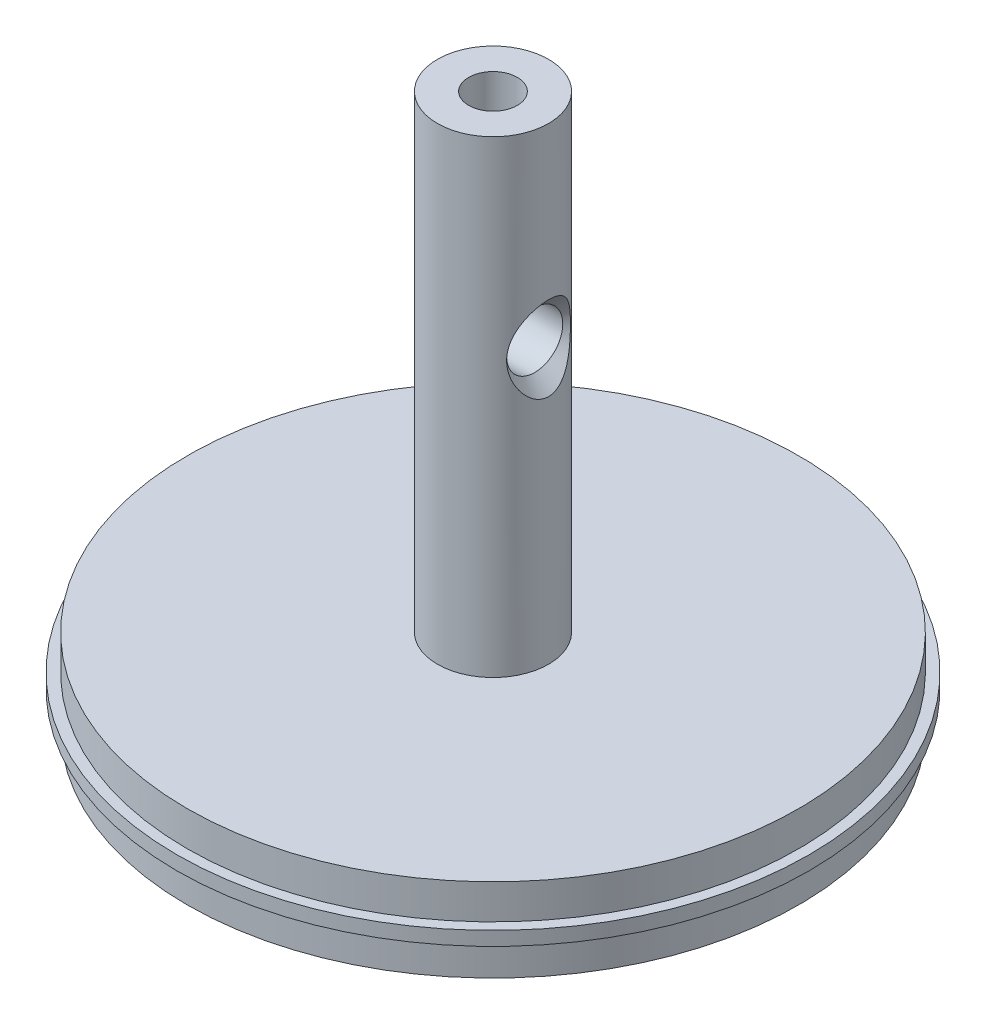
ISO-10303-21;
HEADER;
FILE_DESCRIPTION(('STEP AP214'),'2;1');
FILE_NAME('part.step','',(''),(''),'','','');
FILE_SCHEMA(('AUTOMOTIVE_DESIGN { 1 0 10303 214 1 1 1 1 }'));
ENDSEC;
DATA;
#1=APPLICATION_CONTEXT('core data for automotive mechanical design processes');
#2=APPLICATION_PROTOCOL_DEFINITION('international standard','automotive_design',2000,#1);
#3=PRODUCT_CONTEXT('',#1,'mechanical');
#4=PRODUCT('Part','Part','',(#3));
#5=PRODUCT_RELATED_PRODUCT_CATEGORY('part','',(#4));
#6=PRODUCT_DEFINITION_FORMATION('','',#4);
#7=PRODUCT_DEFINITION_CONTEXT('part definition',#1,'design');
#8=PRODUCT_DEFINITION('design','',#6,#7);
#9=PRODUCT_DEFINITION_SHAPE('','',#8);
#10=(LENGTH_UNIT() NAMED_UNIT(*) SI_UNIT(.MILLI.,.METRE.));
#11=(NAMED_UNIT(*) PLANE_ANGLE_UNIT() SI_UNIT($,.RADIAN.));
#12=(NAMED_UNIT(*) SI_UNIT($,.STERADIAN.) SOLID_ANGLE_UNIT());
#13=UNCERTAINTY_MEASURE_WITH_UNIT(LENGTH_MEASURE(1.E-05),#10,'distance_accuracy_value','');
#14=(GEOMETRIC_REPRESENTATION_CONTEXT(3) GLOBAL_UNCERTAINTY_ASSIGNED_CONTEXT((#13)) GLOBAL_UNIT_ASSIGNED_CONTEXT((#10,
#11,#12)) REPRESENTATION_CONTEXT('',''));
#15=CARTESIAN_POINT('',(0.,0.,0.));
#16=DIRECTION('',(0.,0.,1.));
#17=DIRECTION('',(1.,0.,0.));
#18=AXIS2_PLACEMENT_3D('',#15,#16,#17);
#19=CARTESIAN_POINT('',(0.,41.5,-1.74999999999999));
#20=DIRECTION('',(0.,-1.,0.));
#21=DIRECTION('',(0.,0.,-1.));
#22=AXIS2_PLACEMENT_3D('',#19,#20,#21);
#23=PLANE('',#22);
#24=CARTESIAN_POINT('',(0.,41.5,0.));
#25=DIRECTION('',(0.,1.,0.));
#26=DIRECTION('',(0.,0.,1.));
#27=AXIS2_PLACEMENT_3D('',#24,#25,#26);
#28=CIRCLE('',#27,1.75);
#29=CARTESIAN_POINT('',(0.,41.5,1.75));
#30=VERTEX_POINT('',#29);
#31=EDGE_CURVE('E17',#30,#30,#28,.T.);
#32=ORIENTED_EDGE('',*,*,#31,.T.);
#33=EDGE_LOOP('',(#32));
#34=FACE_BOUND('',#33,.T.);
#35=ADVANCED_FACE('F14',(#34),#23,.F.);
#36=CARTESIAN_POINT('',(-24.2,33.500000056,0.));
#37=DIRECTION('',(-1.,0.,0.));
#38=DIRECTION('',(0.,0.,1.));
#39=AXIS2_PLACEMENT_3D('',#36,#37,#38);
#40=CYLINDRICAL_SURFACE('',#39,2.02);
#41=CARTESIAN_POINT('',(-2.9999999999859,33.500000056,0.));
#42=DIRECTION('',(-1.,0.,0.));
#43=DIRECTION('',(0.,0.,1.));
#44=AXIS2_PLACEMENT_3D('',#41,#42,#43);
#45=CIRCLE('',#44,2.0200000000159);
#46=CARTESIAN_POINT('',(-2.9999999999859,33.500000056,2.0200000000159));
#47=VERTEX_POINT('',#46);
#48=EDGE_CURVE('E30',#47,#47,#45,.T.);
#49=ORIENTED_EDGE('',*,*,#48,.T.);
#50=EDGE_LOOP('',(#49));
#51=FACE_BOUND('',#50,.T.);
#52=CARTESIAN_POINT('',(3.00000000004275,33.500000056,0.));
#53=DIRECTION('',(1.,0.,0.));
#54=DIRECTION('',(0.,0.,-1.));
#55=AXIS2_PLACEMENT_3D('',#52,#53,#54);
#56=CIRCLE('',#55,2.0200000000159);
#57=CARTESIAN_POINT('',(3.00000000004275,33.500000056,-2.0200000000159));
#58=VERTEX_POINT('',#57);
#59=EDGE_CURVE('E154',#58,#58,#56,.T.);
#60=ORIENTED_EDGE('',*,*,#59,.T.);
#61=EDGE_LOOP('',(#60));
#62=FACE_BOUND('',#61,.T.);
#63=ADVANCED_FACE('F171',(#51,#62),#40,.F.);
#64=CARTESIAN_POINT('',(0.,0.,0.));
#65=DIRECTION('',(0.,1.,0.));
#66=DIRECTION('',(0.,0.,1.));
#67=AXIS2_PLACEMENT_3D('',#64,#65,#66);
#68=CYLINDRICAL_SURFACE('',#67,1.75);
#69=ORIENTED_EDGE('',*,*,#31,.F.);
#70=EDGE_LOOP('',(#69));
#71=FACE_BOUND('',#70,.T.);
#72=CARTESIAN_POINT('',(0.,47.5,0.));
#73=DIRECTION('',(0.,1.,0.));
#74=DIRECTION('',(0.,0.,1.));
#75=AXIS2_PLACEMENT_3D('',#72,#73,#74);
#76=CIRCLE('',#75,1.75);
#77=CARTESIAN_POINT('',(0.,47.5,1.75));
#78=VERTEX_POINT('',#77);
#79=EDGE_CURVE('E149',#78,#78,#76,.T.);
#80=ORIENTED_EDGE('',*,*,#79,.T.);
#81=EDGE_LOOP('',(#80));
#82=FACE_BOUND('',#81,.T.);
#83=ADVANCED_FACE('F169',(#71,#82),#68,.F.);
#84=CARTESIAN_POINT('',(-4.00601233315001,33.500000056,0.));
#85=DIRECTION('',(-1.,0.,0.));
#86=DIRECTION('',(0.,0.,1.));
#87=AXIS2_PLACEMENT_3D('',#84,#85,#86);
#88=CONICAL_SURFACE('',#87,3.02601233318001,0.785398163397448);
#89=CARTESIAN_POINT('',(-3.27565970641267,33.500000056,2.29565970644267));
#90=CARTESIAN_POINT('',(-3.27565974324481,33.4092118158667,2.2956596921066));
#91=CARTESIAN_POINT('',(-3.27788709147782,33.3184232462887,2.292491363741));
#92=CARTESIAN_POINT('',(-3.28669961594971,33.1375020687839,2.27983860709496));
#93=CARTESIAN_POINT('',(-3.29328488449686,33.0473694747926,2.27035404502578));
#94=CARTESIAN_POINT('',(-3.31054640868723,32.868307423696,2.24510963577273));
#95=CARTESIAN_POINT('',(-3.32122596750197,32.7793789982153,2.22934472135404));
#96=CARTESIAN_POINT('',(-3.34624805899658,32.6033636772114,2.19160428334429));
#97=CARTESIAN_POINT('',(-3.36059199850475,32.5162775029004,2.16962637411538));
#98=CARTESIAN_POINT('',(-3.40870164285985,32.256675885776,2.09389724843857));
#99=CARTESIAN_POINT('',(-3.44734364124495,32.0877251468258,2.03061698002133));
#100=CARTESIAN_POINT('',(-3.53235409103854,31.7636966014974,1.87883561276387));
#101=CARTESIAN_POINT('',(-3.57872034514942,31.6086148690675,1.79034168131394));
#102=CARTESIAN_POINT('',(-3.66291581015005,31.3493818187934,1.60955798909351));
#103=CARTESIAN_POINT('',(-3.70037586201182,31.241536413045,1.52239787203498));
#104=CARTESIAN_POINT('',(-3.77326449462225,31.0408869674108,1.33149419569041));
#105=CARTESIAN_POINT('',(-3.80869678476365,30.9480548557464,1.22778232377795));
#106=CARTESIAN_POINT('',(-3.86560317496297,30.8032883773588,1.03186017628122));
#107=CARTESIAN_POINT('',(-3.88834830483795,30.7469374997985,0.943299135132875));
#108=CARTESIAN_POINT('',(-3.92876490064366,30.6483294372738,0.757506900453462));
#109=CARTESIAN_POINT('',(-3.94643980566748,30.6060626959921,0.660281642738087));
#110=CARTESIAN_POINT('',(-3.97501789257215,30.5383016481287,0.457979701167635));
#111=CARTESIAN_POINT('',(-3.98585192255134,30.512978469636,0.352834501734346));
#112=CARTESIAN_POINT('',(-3.99900489549181,30.482287006609,0.139163170668475));
#113=CARTESIAN_POINT('',(-4.00133287004582,30.4768975566879,0.0306407485083163));
#114=CARTESIAN_POINT('',(-3.99748624141585,30.4858474793323,-0.168992875478385));
#115=CARTESIAN_POINT('',(-3.99253610659154,30.4973454001589,-0.260271166299784));
#116=CARTESIAN_POINT('',(-3.97680478426647,30.5341899027872,-0.439447182004206));
#117=CARTESIAN_POINT('',(-3.96602222246374,30.5595397485495,-0.527344104900694));
#118=CARTESIAN_POINT('',(-3.93946585858188,30.6227657798893,-0.698730685305303));
#119=CARTESIAN_POINT('',(-3.923639617062,30.6607737688133,-0.782162767866023));
#120=CARTESIAN_POINT('',(-3.8882454212583,30.7472583216757,-0.942497244831615));
#121=CARTESIAN_POINT('',(-3.86867575020681,30.7957396901169,-1.01939661982471));
#122=CARTESIAN_POINT('',(-3.81513632829724,30.9313479423969,-1.20791416220515));
#123=CARTESIAN_POINT('',(-3.77929696649438,31.0247926393147,-1.31446999637464));
#124=CARTESIAN_POINT('',(-3.70532052791033,31.2274819527332,-1.51050809481488));
#125=CARTESIAN_POINT('',(-3.66717726863892,31.3367702940295,-1.59994146592209));
#126=CARTESIAN_POINT('',(-3.5812922133997,31.6000943318196,-1.78537059335953));
#127=CARTESIAN_POINT('',(-3.53390424170363,31.758018736378,-1.8760045402589));
#128=CARTESIAN_POINT('',(-3.44714551455543,32.0882540001124,-2.03103325067719));
#129=CARTESIAN_POINT('',(-3.40777457486,32.2605645285457,-2.0954286172317));
#130=CARTESIAN_POINT('',(-3.35942945266478,32.5231248785664,-2.17142009145738));
#131=CARTESIAN_POINT('',(-3.34527501100093,32.6096369527327,-2.19308592917673));
#132=CARTESIAN_POINT('',(-3.320589334417,32.7844656775545,-2.2302897641301));
#133=CARTESIAN_POINT('',(-3.31005667598611,32.8727816047288,-2.24583016926493));
#134=CARTESIAN_POINT('',(-3.29303502116526,33.0505939340991,-2.2707149750465));
#135=CARTESIAN_POINT('',(-3.28654284455623,33.1400893511259,-2.28006424903692));
#136=CARTESIAN_POINT('',(-3.27785518557515,33.3197230925173,-2.29253659768202));
#137=CARTESIAN_POINT('',(-3.27565966984408,33.4098614118851,-2.29565972067616));
#138=CARTESIAN_POINT('',(-3.27565974324481,33.5907882961333,-2.2956596921066));
#139=CARTESIAN_POINT('',(-3.27788709147782,33.6815768657112,-2.292491363741));
#140=CARTESIAN_POINT('',(-3.28669961594971,33.8624980432161,-2.27983860709496));
#141=CARTESIAN_POINT('',(-3.29328488449686,33.9526306372074,-2.27035404502578));
#142=CARTESIAN_POINT('',(-3.31054640868723,34.131692688304,-2.24510963577273));
#143=CARTESIAN_POINT('',(-3.32122596750197,34.2206211137847,-2.22934472135403));
#144=CARTESIAN_POINT('',(-3.34624805899658,34.3966364347886,-2.19160428334429));
#145=CARTESIAN_POINT('',(-3.36059199850475,34.4837226090997,-2.16962637411537));
#146=CARTESIAN_POINT('',(-3.40870164285985,34.743324226224,-2.09389724843858));
#147=CARTESIAN_POINT('',(-3.44734364124495,34.9122749651742,-2.03061698002133));
#148=CARTESIAN_POINT('',(-3.53235409103854,35.2363035105026,-1.87883561276387));
#149=CARTESIAN_POINT('',(-3.57872034514942,35.3913852429325,-1.79034168131394));
#150=CARTESIAN_POINT('',(-3.66291581015005,35.6506182932066,-1.60955798909351));
#151=CARTESIAN_POINT('',(-3.70037586201182,35.758463698955,-1.52239787203498));
#152=CARTESIAN_POINT('',(-3.77326449462225,35.9591131445892,-1.33149419569041));
#153=CARTESIAN_POINT('',(-3.80869678476365,36.0519452562536,-1.22778232377795));
#154=CARTESIAN_POINT('',(-3.86560317496297,36.1967117346412,-1.03186017628122));
#155=CARTESIAN_POINT('',(-3.88834830483796,36.2530626122015,-0.943299135132871));
#156=CARTESIAN_POINT('',(-3.92876490064366,36.3516706747262,-0.757506900453455));
#157=CARTESIAN_POINT('',(-3.94643980566748,36.3939374160079,-0.660281642738081));
#158=CARTESIAN_POINT('',(-3.97501789257215,36.4616984638713,-0.457979701167627));
#159=CARTESIAN_POINT('',(-3.98585192255134,36.487021642364,-0.352834501734337));
#160=CARTESIAN_POINT('',(-3.99900489549181,36.517713105391,-0.139163170668464));
#161=CARTESIAN_POINT('',(-4.00133287004582,36.5231025553121,-0.0306407485083033));
#162=CARTESIAN_POINT('',(-3.99748624141585,36.5141526326677,0.168992875478399));
#163=CARTESIAN_POINT('',(-3.99253610659153,36.5026547118411,0.260271166299798));
#164=CARTESIAN_POINT('',(-3.97680478426647,36.4658102092128,0.439447182004218));
#165=CARTESIAN_POINT('',(-3.96602222246373,36.4404603634505,0.527344104900705));
#166=CARTESIAN_POINT('',(-3.93946585858188,36.3772343321107,0.698730685305313));
#167=CARTESIAN_POINT('',(-3.923639617062,36.3392263431866,0.782162767866032));
#168=CARTESIAN_POINT('',(-3.8882454212583,36.2527417903243,0.942497244831624));
#169=CARTESIAN_POINT('',(-3.86867575020681,36.2042604218831,1.01939661982472));
#170=CARTESIAN_POINT('',(-3.81513632829724,36.0686521696031,1.20791416220516));
#171=CARTESIAN_POINT('',(-3.77929696649438,35.9752074726853,1.31446999637465));
#172=CARTESIAN_POINT('',(-3.70532052791033,35.7725181592668,1.51050809481489));
#173=CARTESIAN_POINT('',(-3.66717726863892,35.6632298179705,1.5999414659221));
#174=CARTESIAN_POINT('',(-3.5812922133997,35.3999057801803,1.78537059335954));
#175=CARTESIAN_POINT('',(-3.53390424170363,35.241981375622,1.87600454025891));
#176=CARTESIAN_POINT('',(-3.44714551455543,34.9117461118876,2.0310332506772));
#177=CARTESIAN_POINT('',(-3.40777457486,34.7394355834543,2.09542861723171));
#178=CARTESIAN_POINT('',(-3.35942945266477,34.4768752334336,2.17142009145738));
#179=CARTESIAN_POINT('',(-3.34527501100092,34.3903631592673,2.19308592917674));
#180=CARTESIAN_POINT('',(-3.32058933441699,34.2155344344455,2.23028976413011));
#181=CARTESIAN_POINT('',(-3.31005667598611,34.1272185072712,2.24583016926493));
#182=CARTESIAN_POINT('',(-3.29303502116525,33.9494061779008,2.27071497504651));
#183=CARTESIAN_POINT('',(-3.28654284455623,33.8599107608741,2.28006424903692));
#184=CARTESIAN_POINT('',(-3.27785518557515,33.6802770194827,2.29253659768202));
#185=CARTESIAN_POINT('',(-3.27565966984408,33.5901387001149,2.29565972067616));
#186=CARTESIAN_POINT('',(-3.27565970641267,33.500000056,2.29565970644267));
#187=B_SPLINE_CURVE_WITH_KNOTS('',3,(#89,#90,#91,#92,#93,#94,#95,#96,#97,#98,#99,#100,#101,#102,
#103,#104,#105,#106,#107,#108,#109,#110,#111,#112,#113,#114,#115,#116,#117,#118,#119,#120,#121,
#122,#123,#124,#125,#126,#127,#128,#129,#130,#131,#132,#133,#134,#135,#136,#137,#138,#139,#140,
#141,#142,#143,#144,#145,#146,#147,#148,#149,#150,#151,#152,#153,#154,#155,#156,#157,#158,#159,
#160,#161,#162,#163,#164,#165,#166,#167,#168,#169,#170,#171,#172,#173,#174,#175,#176,#177,#178,
#179,#180,#181,#182,#183,#184,#185,#186),.UNSPECIFIED.,.T.,.F.,(4,2,2,2,2,2,2,2,2,2,2,2,2,2,2,2,
2,2,2,2,2,2,2,2,2,2,2,2,2,2,2,2,2,2,2,2,2,2,2,2,2,2,2,2,2,2,2,2,4),(0.,0.272282900695318,
0.544571568996871,0.817080376885123,1.0896939639409,1.64066310003553,2.19147577026447,
2.6209620849894,3.04963582438114,3.37068938251287,3.69152465485104,4.01555329190702,
4.33923778042942,4.61430899096542,4.88944504512383,5.1675405269361,5.44576385273193,
5.8818753353105,6.31921414331937,6.88087761136937,7.44252817010183,7.7131846853597,
7.98373469947736,8.25407149643022,8.52440619449603,8.79668909519135,9.06897776349291,
9.34148657138117,9.61410015843694,10.1650692945316,10.7158819647605,11.1453682794854,
11.5740420188772,11.8950955770089,12.2159308493471,12.5399594864031,12.8636439749255,
13.1387151854615,13.4138512396199,13.6919467214321,13.970170047228,14.4062815298066,
14.8436203378154,15.4052838058654,15.9669343645979,16.2375908798558,16.5081408939734,
16.7784776909263,17.0488123889921),.UNSPECIFIED.);
#188=CARTESIAN_POINT('',(-3.27565970641267,33.500000056,2.29565970644267));
#189=VERTEX_POINT('',#188);
#190=EDGE_CURVE('E71',#189,#189,#187,.T.);
#191=ORIENTED_EDGE('',*,*,#190,.F.);
#192=EDGE_LOOP('',(#191));
#193=FACE_BOUND('',#192,.T.);
#194=ORIENTED_EDGE('',*,*,#48,.F.);
#195=EDGE_LOOP('',(#194));
#196=FACE_BOUND('',#195,.T.);
#197=ADVANCED_FACE('F94',(#193,#196),#88,.F.);
#198=CARTESIAN_POINT('',(4.00602623886925,33.500000056,0.));
#199=DIRECTION('',(1.,0.,0.));
#200=DIRECTION('',(0.,0.,-1.));
#201=AXIS2_PLACEMENT_3D('',#198,#199,#200);
#202=CONICAL_SURFACE('',#201,3.02602623884241,0.785398163397448);
#203=CARTESIAN_POINT('',(3.2756597064361,33.500000056,-2.29565970640925));
#204=CARTESIAN_POINT('',(3.27565974326823,33.4092118158683,-2.29565969207318));
#205=CARTESIAN_POINT('',(3.27788709150117,33.3184232462918,-2.29249136370761));
#206=CARTESIAN_POINT('',(3.28669961597278,33.13750206879,-2.27983860706171));
#207=CARTESIAN_POINT('',(3.29328488451972,33.0473694748002,-2.27035404499261));
#208=CARTESIAN_POINT('',(3.31054640870954,32.8683074237067,-2.24510963573983));
#209=CARTESIAN_POINT('',(3.32122596752394,32.7793789982275,-2.22934472132129));
#210=CARTESIAN_POINT('',(3.34624805901777,32.6033636772265,-2.19160428331193));
#211=CARTESIAN_POINT('',(3.36059199852549,32.5162775029169,-2.16962637408323));
#212=CARTESIAN_POINT('',(3.40870164287909,32.256675885797,-2.09389724840723));
#213=CARTESIAN_POINT('',(3.44734364126298,32.0877251468498,-2.03061697999067));
#214=CARTESIAN_POINT('',(3.53235409105392,31.7636966015273,-1.87883561273489));
#215=CARTESIAN_POINT('',(3.57872034516336,31.6086148691002,-1.79034168128597));
#216=CARTESIAN_POINT('',(3.66291581016136,31.3493818188309,-1.60955798906768));
#217=CARTESIAN_POINT('',(3.70037586202196,31.2415364130847,-1.52239787201021));
#218=CARTESIAN_POINT('',(3.77326449463008,31.0408869674545,-1.33149419566809));
#219=CARTESIAN_POINT('',(3.80869678477035,30.9480548557921,-1.22778232375701));
#220=CARTESIAN_POINT('',(3.86560317496789,30.8032883774073,-1.03186017626268));
#221=CARTESIAN_POINT('',(3.88834830484221,30.7469374998481,-0.943299135115235));
#222=CARTESIAN_POINT('',(3.92876490064666,30.6483294373253,-0.757506900437801));
#223=CARTESIAN_POINT('',(3.94643980566989,30.6060626960447,-0.660281642723503));
#224=CARTESIAN_POINT('',(3.97501789257353,30.538301648183,-0.457979701155428));
#225=CARTESIAN_POINT('',(3.98585192255227,30.512978469691,-0.352834501723443));
#226=CARTESIAN_POINT('',(3.99900489549206,30.4822870066653,-0.139163170660334));
#227=CARTESIAN_POINT('',(4.00133287004583,30.4768975567447,-0.0306407485016326));
#228=CARTESIAN_POINT('',(3.99748624141565,30.4858474793896,0.168992875482587));
#229=CARTESIAN_POINT('',(3.9925361065913,30.4973454002165,0.260271166302968));
#230=CARTESIAN_POINT('',(3.97680478426632,30.534189902845,0.439447182005348));
#231=CARTESIAN_POINT('',(3.9660222224637,30.5595397486073,0.527344104900813));
#232=CARTESIAN_POINT('',(3.93946585858216,30.6227657799471,0.698730685303607));
#233=CARTESIAN_POINT('',(3.92363961706248,30.6607737688711,0.782162767863521));
#234=CARTESIAN_POINT('',(3.88824542125928,30.7472583217334,0.942497244827525));
#235=CARTESIAN_POINT('',(3.86867575020808,30.7957396901745,1.01939661981984));
#236=CARTESIAN_POINT('',(3.81513632829947,30.9313479424539,1.20791416219794));
#237=CARTESIAN_POINT('',(3.77929696649736,31.024792639371,1.31446999636594));
#238=CARTESIAN_POINT('',(3.70532052791499,31.2274819527882,1.51050809480335));
#239=CARTESIAN_POINT('',(3.6671772686445,31.3367702940837,1.5999414659092));
#240=CARTESIAN_POINT('',(3.58129221340792,31.6000943318708,1.78537059334287));
#241=CARTESIAN_POINT('',(3.53390424171358,31.7580187364267,1.87600454024003));
#242=CARTESIAN_POINT('',(3.44714551456883,32.0882540001558,2.03103325065435));
#243=CARTESIAN_POINT('',(3.40777457487511,32.2605645285862,2.09542861720708));
#244=CARTESIAN_POINT('',(3.35942945268248,32.5231248786011,2.17142009142996));
#245=CARTESIAN_POINT('',(3.34527501101958,32.6096369527643,2.19308592914827));
#246=CARTESIAN_POINT('',(3.32058933443731,32.7844656775801,2.23028976409985));
#247=CARTESIAN_POINT('',(3.31005667600714,32.8727816047512,2.24583016923392));
#248=CARTESIAN_POINT('',(3.29303502118746,33.0505939341153,2.27071497501429));
#249=CARTESIAN_POINT('',(3.28654284457889,33.1400893511388,2.28006424900426));
#250=CARTESIAN_POINT('',(3.27785518559842,33.3197230925238,2.29253659764875));
#251=CARTESIAN_POINT('',(3.2756596698675,33.4098614118883,2.29565972064274));
#252=CARTESIAN_POINT('',(3.27565974326823,33.5907882961317,2.29565969207318));
#253=CARTESIAN_POINT('',(3.27788709150117,33.6815768657082,2.29249136370761));
#254=CARTESIAN_POINT('',(3.28669961597278,33.86249804321,2.2798386070617));
#255=CARTESIAN_POINT('',(3.29328488451972,33.9526306371998,2.27035404499261));
#256=CARTESIAN_POINT('',(3.31054640870955,34.1316926882934,2.24510963573982));
#257=CARTESIAN_POINT('',(3.32122596752395,34.2206211137725,2.22934472132129));
#258=CARTESIAN_POINT('',(3.34624805901778,34.3966364347735,2.19160428331192));
#259=CARTESIAN_POINT('',(3.3605919985255,34.4837226090831,2.16962637408323));
#260=CARTESIAN_POINT('',(3.40870164287909,34.743324226203,2.09389724840722));
#261=CARTESIAN_POINT('',(3.44734364126298,34.9122749651502,2.03061697999066));
#262=CARTESIAN_POINT('',(3.53235409105393,35.2363035104728,1.87883561273488));
#263=CARTESIAN_POINT('',(3.57872034516337,35.3913852428999,1.79034168128596));
#264=CARTESIAN_POINT('',(3.66291581016137,35.6506182931691,1.60955798906766));
#265=CARTESIAN_POINT('',(3.70037586202197,35.7584636989154,1.5223978720102));
#266=CARTESIAN_POINT('',(3.77326449463009,35.9591131445455,1.33149419566808));
#267=CARTESIAN_POINT('',(3.80869678477035,36.051945256208,1.227782323757));
#268=CARTESIAN_POINT('',(3.8656031749679,36.1967117345927,1.03186017626267));
#269=CARTESIAN_POINT('',(3.88834830484221,36.2530626121519,0.943299135115228));
#270=CARTESIAN_POINT('',(3.92876490064666,36.3516706746747,0.757506900437791));
#271=CARTESIAN_POINT('',(3.94643980566989,36.3939374159553,0.660281642723492));
#272=CARTESIAN_POINT('',(3.97501789257353,36.461698463817,0.457979701155417));
#273=CARTESIAN_POINT('',(3.98585192255227,36.487021642309,0.352834501723432));
#274=CARTESIAN_POINT('',(3.99900489549206,36.5177131053347,0.139163170660324));
#275=CARTESIAN_POINT('',(4.00133287004583,36.5231025552553,0.0306407485016236));
#276=CARTESIAN_POINT('',(3.99748624141565,36.5141526326103,-0.168992875482596));
#277=CARTESIAN_POINT('',(3.9925361065913,36.5026547117835,-0.260271166302977));
#278=CARTESIAN_POINT('',(3.97680478426632,36.465810209155,-0.439447182005357));
#279=CARTESIAN_POINT('',(3.9660222224637,36.4404603633927,-0.527344104900821));
#280=CARTESIAN_POINT('',(3.93946585858216,36.3772343320529,-0.698730685303615));
#281=CARTESIAN_POINT('',(3.92363961706248,36.3392263431289,-0.782162767863529));
#282=CARTESIAN_POINT('',(3.88824542125927,36.2527417902666,-0.942497244827533));
#283=CARTESIAN_POINT('',(3.86867575020807,36.2042604218255,-1.01939661981985));
#284=CARTESIAN_POINT('',(3.81513632829947,36.0686521695461,-1.20791416219795));
#285=CARTESIAN_POINT('',(3.77929696649736,35.975207472629,-1.31446999636595));
#286=CARTESIAN_POINT('',(3.70532052791499,35.7725181592118,-1.51050809480336));
#287=CARTESIAN_POINT('',(3.6671772686445,35.6632298179163,-1.59994146590921));
#288=CARTESIAN_POINT('',(3.58129221340792,35.3999057801292,-1.78537059334287));
#289=CARTESIAN_POINT('',(3.53390424171358,35.2419813755733,-1.87600454024004));
#290=CARTESIAN_POINT('',(3.44714551456882,34.9117461118441,-2.03103325065435));
#291=CARTESIAN_POINT('',(3.4077745748751,34.7394355834137,-2.09542861720708));
#292=CARTESIAN_POINT('',(3.35942945268248,34.4768752333989,-2.17142009142997));
#293=CARTESIAN_POINT('',(3.34527501101957,34.3903631592356,-2.19308592914828));
#294=CARTESIAN_POINT('',(3.32058933443731,34.2155344344199,-2.23028976409985));
#295=CARTESIAN_POINT('',(3.31005667600714,34.1272185072488,-2.24583016923392));
#296=CARTESIAN_POINT('',(3.29303502118746,33.9494061778847,-2.27071497501429));
#297=CARTESIAN_POINT('',(3.28654284457889,33.8599107608612,-2.28006424900426));
#298=CARTESIAN_POINT('',(3.27785518559842,33.6802770194762,-2.29253659764875));
#299=CARTESIAN_POINT('',(3.2756596698675,33.5901387001117,-2.29565972064274));
#300=CARTESIAN_POINT('',(3.2756597064361,33.500000056,-2.29565970640925));
#301=B_SPLINE_CURVE_WITH_KNOTS('',3,(#203,#204,#205,#206,#207,#208,#209,#210,#211,#212,#213,
#214,#215,#216,#217,#218,#219,#220,#221,#222,#223,#224,#225,#226,#227,#228,#229,#230,#231,#232,
#233,#234,#235,#236,#237,#238,#239,#240,#241,#242,#243,#244,#245,#246,#247,#248,#249,#250,#251,
#252,#253,#254,#255,#256,#257,#258,#259,#260,#261,#262,#263,#264,#265,#266,#267,#268,#269,#270,
#271,#272,#273,#274,#275,#276,#277,#278,#279,#280,#281,#282,#283,#284,#285,#286,#287,#288,#289,
#290,#291,#292,#293,#294,#295,#296,#297,#298,#299,#300),.UNSPECIFIED.,.T.,.F.,(4,2,2,2,2,2,2,2,
2,2,2,2,2,2,2,2,2,2,2,2,2,2,2,2,2,2,2,2,2,2,2,2,2,2,2,2,2,2,2,2,2,2,2,2,2,2,2,2,4),(0.,
0.272282900690734,0.544571568987704,0.817080376871365,1.08969396392256,1.64066310000758,
2.19147577022687,2.62096208494425,3.04963582432846,3.37068938245588,3.69152465478973,
4.01555329184129,4.33923778035929,4.61430899089236,4.88944504504784,5.16754052685783,
5.44576385265138,5.88187533522505,6.31921414322898,6.88087761126836,7.44252816999014,
7.71318468523824,7.98373469934614,8.25407149628927,8.52440619434535,8.79668909503609,
9.06897776333306,9.34148657121672,9.61410015826791,10.1650692943529,10.7158819645722,
11.1453682792896,11.5740420186738,11.8950955768012,12.2159308491351,12.5399594861866,
12.8636439747046,13.1387151852377,13.4138512393932,13.6919467212032,13.9701700469967,
14.4062815295704,14.8436203375743,15.4052838056137,15.9669343643355,16.2375908795836,
16.5081408936915,16.7784776906346,17.0488123886907),.UNSPECIFIED.);
#302=CARTESIAN_POINT('',(3.2756597064361,33.500000056,-2.29565970640925));
#303=VERTEX_POINT('',#302);
#304=EDGE_CURVE('E62',#303,#303,#301,.T.);
#305=ORIENTED_EDGE('',*,*,#304,.F.);
#306=EDGE_LOOP('',(#305));
#307=FACE_BOUND('',#306,.T.);
#308=ORIENTED_EDGE('',*,*,#59,.F.);
#309=EDGE_LOOP('',(#308));
#310=FACE_BOUND('',#309,.T.);
#311=ADVANCED_FACE('F76',(#307,#310),#202,.F.);
#312=CARTESIAN_POINT('',(0.,47.5,-1.75));
#313=DIRECTION('',(0.,-1.,0.));
#314=DIRECTION('',(0.,0.,-1.));
#315=AXIS2_PLACEMENT_3D('',#312,#313,#314);
#316=PLANE('',#315);
#317=CARTESIAN_POINT('',(0.,47.5,0.));
#318=DIRECTION('',(0.,1.,0.));
#319=DIRECTION('',(0.,0.,1.));
#320=AXIS2_PLACEMENT_3D('',#317,#318,#319);
#321=CIRCLE('',#320,4.);
#322=CARTESIAN_POINT('',(0.,47.5,4.));
#323=VERTEX_POINT('',#322);
#324=EDGE_CURVE('E58',#323,#323,#321,.F.);
#325=ORIENTED_EDGE('',*,*,#324,.F.);
#326=EDGE_LOOP('',(#325));
#327=FACE_BOUND('',#326,.T.);
#328=ORIENTED_EDGE('',*,*,#79,.F.);
#329=EDGE_LOOP('',(#328));
#330=FACE_BOUND('',#329,.T.);
#331=ADVANCED_FACE('F84',(#327,#330),#316,.F.);
#332=CARTESIAN_POINT('',(0.,0.,0.));
#333=DIRECTION('',(0.,1.,0.));
#334=DIRECTION('',(0.,0.,1.));
#335=AXIS2_PLACEMENT_3D('',#332,#333,#334);
#336=CYLINDRICAL_SURFACE('',#335,4.);
#337=ORIENTED_EDGE('',*,*,#324,.T.);
#338=EDGE_LOOP('',(#337));
#339=FACE_BOUND('',#338,.T.);
#340=CARTESIAN_POINT('',(0.,13.799999938,0.));
#341=DIRECTION('',(0.,1.,0.));
#342=DIRECTION('',(0.,0.,1.));
#343=AXIS2_PLACEMENT_3D('',#340,#341,#342);
#344=CIRCLE('',#343,4.);
#345=CARTESIAN_POINT('',(0.,13.799999938,4.));
#346=VERTEX_POINT('',#345);
#347=EDGE_CURVE('E55',#346,#346,#344,.T.);
#348=ORIENTED_EDGE('',*,*,#347,.T.);
#349=EDGE_LOOP('',(#348));
#350=FACE_BOUND('',#349,.T.);
#351=ORIENTED_EDGE('',*,*,#304,.T.);
#352=EDGE_LOOP('',(#351));
#353=FACE_BOUND('',#352,.T.);
#354=ORIENTED_EDGE('',*,*,#190,.T.);
#355=EDGE_LOOP('',(#354));
#356=FACE_BOUND('',#355,.T.);
#357=ADVANCED_FACE('F79',(#339,#350,#353,#356),#336,.T.);
#358=CARTESIAN_POINT('',(0.,13.799999938,-4.00000000000001));
#359=DIRECTION('',(0.,-1.,0.));
#360=DIRECTION('',(0.,0.,-1.));
#361=AXIS2_PLACEMENT_3D('',#358,#359,#360);
#362=PLANE('',#361);
#363=CARTESIAN_POINT('',(0.,13.799999938,0.));
#364=DIRECTION('',(0.,1.,0.));
#365=DIRECTION('',(0.,0.,1.));
#366=AXIS2_PLACEMENT_3D('',#363,#364,#365);
#367=CIRCLE('',#366,22.);
#368=CARTESIAN_POINT('',(0.,13.799999938,22.));
#369=VERTEX_POINT('',#368);
#370=EDGE_CURVE('E51',#369,#369,#367,.F.);
#371=ORIENTED_EDGE('',*,*,#370,.F.);
#372=EDGE_LOOP('',(#371));
#373=FACE_BOUND('',#372,.T.);
#374=ORIENTED_EDGE('',*,*,#347,.F.);
#375=EDGE_LOOP('',(#374));
#376=FACE_BOUND('',#375,.T.);
#377=ADVANCED_FACE('F83',(#373,#376),#362,.F.);
#378=CARTESIAN_POINT('',(0.,0.,0.));
#379=DIRECTION('',(0.,1.,0.));
#380=DIRECTION('',(0.,0.,1.));
#381=AXIS2_PLACEMENT_3D('',#378,#379,#380);
#382=CYLINDRICAL_SURFACE('',#381,22.);
#383=ORIENTED_EDGE('',*,*,#370,.T.);
#384=EDGE_LOOP('',(#383));
#385=FACE_BOUND('',#384,.T.);
#386=CARTESIAN_POINT('',(0.,11.299999969,0.));
#387=DIRECTION('',(0.,1.,0.));
#388=DIRECTION('',(0.,0.,1.));
#389=AXIS2_PLACEMENT_3D('',#386,#387,#388);
#390=CIRCLE('',#389,22.);
#391=CARTESIAN_POINT('',(0.,11.299999969,22.));
#392=VERTEX_POINT('',#391);
#393=EDGE_CURVE('E47',#392,#392,#390,.T.);
#394=ORIENTED_EDGE('',*,*,#393,.T.);
#395=EDGE_LOOP('',(#394));
#396=FACE_BOUND('',#395,.T.);
#397=ADVANCED_FACE('F127',(#385,#396),#382,.T.);
#398=CARTESIAN_POINT('',(0.,11.299999969,-22.));
#399=DIRECTION('',(0.,-1.,0.));
#400=DIRECTION('',(0.,0.,-1.));
#401=AXIS2_PLACEMENT_3D('',#398,#399,#400);
#402=PLANE('',#401);
#403=CARTESIAN_POINT('',(0.,11.299999969,0.));
#404=DIRECTION('',(0.,1.,0.));
#405=DIRECTION('',(0.,0.,1.));
#406=AXIS2_PLACEMENT_3D('',#403,#404,#405);
#407=CIRCLE('',#406,22.7457);
#408=CARTESIAN_POINT('',(0.,11.299999969,22.7457));
#409=VERTEX_POINT('',#408);
#410=EDGE_CURVE('E43',#409,#409,#407,.F.);
#411=ORIENTED_EDGE('',*,*,#410,.F.);
#412=EDGE_LOOP('',(#411));
#413=FACE_BOUND('',#412,.T.);
#414=ORIENTED_EDGE('',*,*,#393,.F.);
#415=EDGE_LOOP('',(#414));
#416=FACE_BOUND('',#415,.T.);
#417=ADVANCED_FACE('F124',(#413,#416),#402,.F.);
#418=CARTESIAN_POINT('',(0.,0.,0.));
#419=DIRECTION('',(0.,1.,0.));
#420=DIRECTION('',(0.,0.,1.));
#421=AXIS2_PLACEMENT_3D('',#418,#419,#420);
#422=CYLINDRICAL_SURFACE('',#421,22.7457);
#423=ORIENTED_EDGE('',*,*,#410,.T.);
#424=EDGE_LOOP('',(#423));
#425=FACE_BOUND('',#424,.T.);
#426=CARTESIAN_POINT('',(0.,10.299999969,0.));
#427=DIRECTION('',(0.,1.,0.));
#428=DIRECTION('',(0.,0.,1.));
#429=AXIS2_PLACEMENT_3D('',#426,#427,#428);
#430=CIRCLE('',#429,22.7457);
#431=CARTESIAN_POINT('',(0.,10.299999969,22.7457));
#432=VERTEX_POINT('',#431);
#433=EDGE_CURVE('E39',#432,#432,#430,.T.);
#434=ORIENTED_EDGE('',*,*,#433,.T.);
#435=EDGE_LOOP('',(#434));
#436=FACE_BOUND('',#435,.T.);
#437=ADVANCED_FACE('F120',(#425,#436),#422,.T.);
#438=CARTESIAN_POINT('',(0.,10.299999969,-22.7457));
#439=DIRECTION('',(0.,1.,0.));
#440=DIRECTION('',(0.,0.,1.));
#441=AXIS2_PLACEMENT_3D('',#438,#439,#440);
#442=PLANE('',#441);
#443=CARTESIAN_POINT('',(0.,10.299999969,0.));
#444=DIRECTION('',(0.,1.,0.));
#445=DIRECTION('',(0.,0.,1.));
#446=AXIS2_PLACEMENT_3D('',#443,#444,#445);
#447=CIRCLE('',#446,22.);
#448=CARTESIAN_POINT('',(0.,10.299999969,22.));
#449=VERTEX_POINT('',#448);
#450=EDGE_CURVE('E35',#449,#449,#447,.F.);
#451=ORIENTED_EDGE('',*,*,#450,.F.);
#452=EDGE_LOOP('',(#451));
#453=FACE_BOUND('',#452,.T.);
#454=ORIENTED_EDGE('',*,*,#433,.F.);
#455=EDGE_LOOP('',(#454));
#456=FACE_BOUND('',#455,.T.);
#457=ADVANCED_FACE('F116',(#453,#456),#442,.F.);
#458=CARTESIAN_POINT('',(0.,0.,-4.));
#459=DIRECTION('',(0.,1.,0.));
#460=DIRECTION('',(0.,0.,1.));
#461=AXIS2_PLACEMENT_3D('',#458,#459,#460);
#462=PLANE('',#461);
#463=CARTESIAN_POINT('',(0.,0.,0.));
#464=DIRECTION('',(0.,1.,0.));
#465=DIRECTION('',(0.,0.,1.));
#466=AXIS2_PLACEMENT_3D('',#463,#464,#465);
#467=CIRCLE('',#466,4.);
#468=CARTESIAN_POINT('',(0.,0.,4.));
#469=VERTEX_POINT('',#468);
#470=EDGE_CURVE('E27',#469,#469,#467,.T.);
#471=ORIENTED_EDGE('',*,*,#470,.F.);
#472=EDGE_LOOP('',(#471));
#473=FACE_BOUND('',#472,.T.);
#474=ADVANCED_FACE('F112',(#473),#462,.F.);
#475=CARTESIAN_POINT('',(0.,0.,0.));
#476=DIRECTION('',(0.,1.,0.));
#477=DIRECTION('',(0.,0.,1.));
#478=AXIS2_PLACEMENT_3D('',#475,#476,#477);
#479=CYLINDRICAL_SURFACE('',#478,22.);
#480=ORIENTED_EDGE('',*,*,#450,.T.);
#481=EDGE_LOOP('',(#480));
#482=FACE_BOUND('',#481,.T.);
#483=CARTESIAN_POINT('',(0.,7.8,0.));
#484=DIRECTION('',(0.,1.,0.));
#485=DIRECTION('',(0.,0.,1.));
#486=AXIS2_PLACEMENT_3D('',#483,#484,#485);
#487=CIRCLE('',#486,22.);
#488=CARTESIAN_POINT('',(0.,7.8,22.));
#489=VERTEX_POINT('',#488);
#490=EDGE_CURVE('E21',#489,#489,#487,.T.);
#491=ORIENTED_EDGE('',*,*,#490,.T.);
#492=EDGE_LOOP('',(#491));
#493=FACE_BOUND('',#492,.T.);
#494=ADVANCED_FACE('F106',(#482,#493),#479,.T.);
#495=CARTESIAN_POINT('',(0.,0.,0.));
#496=DIRECTION('',(0.,1.,0.));
#497=DIRECTION('',(0.,0.,1.));
#498=AXIS2_PLACEMENT_3D('',#495,#496,#497);
#499=CYLINDRICAL_SURFACE('',#498,4.);
#500=CARTESIAN_POINT('',(0.,7.8,0.));
#501=DIRECTION('',(0.,1.,0.));
#502=DIRECTION('',(0.,0.,1.));
#503=AXIS2_PLACEMENT_3D('',#500,#501,#502);
#504=CIRCLE('',#503,4.);
#505=CARTESIAN_POINT('',(0.,7.8,4.));
#506=VERTEX_POINT('',#505);
#507=EDGE_CURVE('E10',#506,#506,#504,.F.);
#508=ORIENTED_EDGE('',*,*,#507,.T.);
#509=EDGE_LOOP('',(#508));
#510=FACE_BOUND('',#509,.T.);
#511=ORIENTED_EDGE('',*,*,#470,.T.);
#512=EDGE_LOOP('',(#511));
#513=FACE_BOUND('',#512,.T.);
#514=ADVANCED_FACE('F100',(#510,#513),#499,.T.);
#515=CARTESIAN_POINT('',(0.,7.8,-4.00000000000001));
#516=DIRECTION('',(0.,1.,0.));
#517=DIRECTION('',(0.,0.,1.));
#518=AXIS2_PLACEMENT_3D('',#515,#516,#517);
#519=PLANE('',#518);
#520=ORIENTED_EDGE('',*,*,#507,.F.);
#521=EDGE_LOOP('',(#520));
#522=FACE_BOUND('',#521,.T.);
#523=ORIENTED_EDGE('',*,*,#490,.F.);
#524=EDGE_LOOP('',(#523));
#525=FACE_BOUND('',#524,.T.);
#526=ADVANCED_FACE('F98',(#522,#525),#519,.F.);
#527=CLOSED_SHELL('',(#35,#63,#83,#197,#311,#331,#357,#377,#397,#417,#437,#457,#474,#494,#514,#526));
#528=MANIFOLD_SOLID_BREP('B1',#527);
#529=ADVANCED_BREP_SHAPE_REPRESENTATION('',(#18,#528),#14);
#530=SHAPE_DEFINITION_REPRESENTATION(#9,#529);
ENDSEC;
END-ISO-10303-21;
